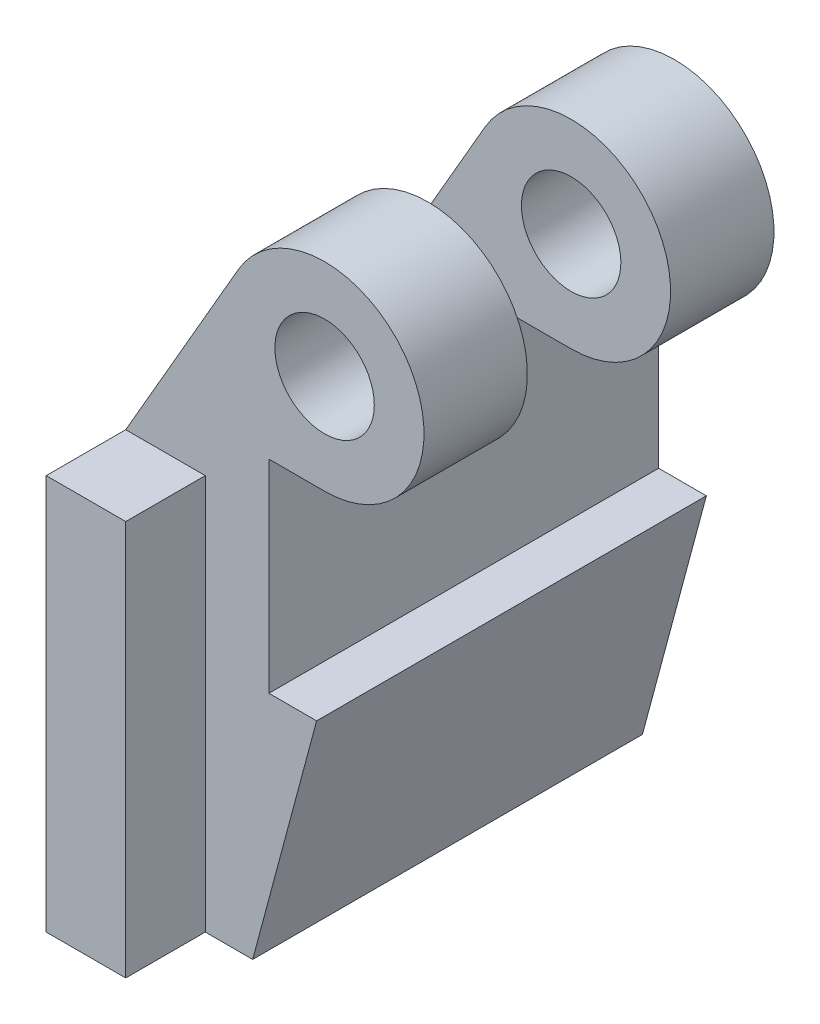
ISO-10303-21;
HEADER;
FILE_DESCRIPTION(('STEP AP214'),'2;1');
FILE_NAME('part.step','',(''),(''),'','','');
FILE_SCHEMA(('AUTOMOTIVE_DESIGN { 1 0 10303 214 1 1 1 1 }'));
ENDSEC;
DATA;
#1=APPLICATION_CONTEXT('core data for automotive mechanical design processes');
#2=APPLICATION_PROTOCOL_DEFINITION('international standard','automotive_design',2000,#1);
#3=PRODUCT_CONTEXT('',#1,'mechanical');
#4=PRODUCT('Part','Part','',(#3));
#5=PRODUCT_RELATED_PRODUCT_CATEGORY('part','',(#4));
#6=PRODUCT_DEFINITION_FORMATION('','',#4);
#7=PRODUCT_DEFINITION_CONTEXT('part definition',#1,'design');
#8=PRODUCT_DEFINITION('design','',#6,#7);
#9=PRODUCT_DEFINITION_SHAPE('','',#8);
#10=(LENGTH_UNIT() NAMED_UNIT(*) SI_UNIT(.MILLI.,.METRE.));
#11=(NAMED_UNIT(*) PLANE_ANGLE_UNIT() SI_UNIT($,.RADIAN.));
#12=(NAMED_UNIT(*) SI_UNIT($,.STERADIAN.) SOLID_ANGLE_UNIT());
#13=UNCERTAINTY_MEASURE_WITH_UNIT(LENGTH_MEASURE(1.E-05),#10,'distance_accuracy_value','');
#14=(GEOMETRIC_REPRESENTATION_CONTEXT(3) GLOBAL_UNCERTAINTY_ASSIGNED_CONTEXT((#13)) GLOBAL_UNIT_ASSIGNED_CONTEXT((#10,
#11,#12)) REPRESENTATION_CONTEXT('',''));
#15=CARTESIAN_POINT('',(0.,0.,0.));
#16=DIRECTION('',(0.,0.,1.));
#17=DIRECTION('',(1.,0.,0.));
#18=AXIS2_PLACEMENT_3D('',#15,#16,#17);
#19=CARTESIAN_POINT('',(-4.699,-4.318,5.08));
#20=DIRECTION('',(-1.,0.,0.));
#21=DIRECTION('',(0.,0.,1.));
#22=AXIS2_PLACEMENT_3D('',#19,#20,#21);
#23=PLANE('',#22);
#24=DIRECTION('',(0.,0.,1.));
#25=VECTOR('',#24,1.);
#26=CARTESIAN_POINT('',(-4.699,-2.667,5.08));
#27=LINE('',#26,#25);
#28=CARTESIAN_POINT('',(-4.699,-2.667,-1.143));
#29=VERTEX_POINT('',#28);
#30=CARTESIAN_POINT('',(-4.69900000000001,-2.667,-0.508));
#31=VERTEX_POINT('',#30);
#32=EDGE_CURVE('E543',#29,#31,#27,.T.);
#33=ORIENTED_EDGE('',*,*,#32,.T.);
#34=DIRECTION('',(0.,1.,0.));
#35=VECTOR('',#34,1.);
#36=CARTESIAN_POINT('',(-4.699,-4.318,-0.508));
#37=LINE('',#36,#35);
#38=CARTESIAN_POINT('',(-4.699,-2.6035,-0.508));
#39=VERTEX_POINT('',#38);
#40=EDGE_CURVE('E552',#31,#39,#37,.T.);
#41=ORIENTED_EDGE('',*,*,#40,.T.);
#42=DIRECTION('',(0.,0.,-1.));
#43=VECTOR('',#42,1.);
#44=CARTESIAN_POINT('',(-4.699,-2.6035,5.08));
#45=LINE('',#44,#43);
#46=CARTESIAN_POINT('',(-4.699,-2.6035,1.143));
#47=VERTEX_POINT('',#46);
#48=EDGE_CURVE('E659',#47,#39,#45,.T.);
#49=ORIENTED_EDGE('',*,*,#48,.F.);
#50=DIRECTION('',(0.,1.,0.));
#51=VECTOR('',#50,1.);
#52=CARTESIAN_POINT('',(-4.699,-4.318,1.143));
#53=LINE('',#52,#51);
#54=CARTESIAN_POINT('',(-4.699,-2.667,1.143));
#55=VERTEX_POINT('',#54);
#56=EDGE_CURVE('E577',#55,#47,#53,.T.);
#57=ORIENTED_EDGE('',*,*,#56,.F.);
#58=DIRECTION('',(0.,0.,1.));
#59=VECTOR('',#58,1.);
#60=CARTESIAN_POINT('',(-4.699,-2.667,5.08));
#61=LINE('',#60,#59);
#62=CARTESIAN_POINT('',(-4.699,-2.667,3.429));
#63=VERTEX_POINT('',#62);
#64=EDGE_CURVE('E580',#55,#63,#61,.T.);
#65=ORIENTED_EDGE('',*,*,#64,.T.);
#66=DIRECTION('',(0.,1.,0.));
#67=VECTOR('',#66,1.);
#68=CARTESIAN_POINT('',(-4.699,-4.318,3.429));
#69=LINE('',#68,#67);
#70=CARTESIAN_POINT('',(-4.699,-2.6035,3.429));
#71=VERTEX_POINT('',#70);
#72=EDGE_CURVE('E567',#63,#71,#69,.T.);
#73=ORIENTED_EDGE('',*,*,#72,.T.);
#74=CARTESIAN_POINT('',(-4.699,-2.6035,5.08));
#75=VERTEX_POINT('',#74);
#76=EDGE_CURVE('E502',#75,#71,#45,.T.);
#77=ORIENTED_EDGE('',*,*,#76,.F.);
#78=DIRECTION('',(0.,-1.,0.));
#79=VECTOR('',#78,1.);
#80=CARTESIAN_POINT('',(-4.699,-4.318,5.08));
#81=LINE('',#80,#79);
#82=CARTESIAN_POINT('',(-4.699,-5.842,5.08));
#83=VERTEX_POINT('',#82);
#84=EDGE_CURVE('E494',#75,#83,#81,.T.);
#85=ORIENTED_EDGE('',*,*,#84,.T.);
#86=DIRECTION('',(0.,0.,1.));
#87=VECTOR('',#86,1.);
#88=CARTESIAN_POINT('',(-4.699,-5.842,-1.143));
#89=LINE('',#88,#87);
#90=CARTESIAN_POINT('',(-4.699,-5.842,-1.143));
#91=VERTEX_POINT('',#90);
#92=EDGE_CURVE('E498',#91,#83,#89,.T.);
#93=ORIENTED_EDGE('',*,*,#92,.F.);
#94=DIRECTION('',(0.,-1.,0.));
#95=VECTOR('',#94,1.);
#96=CARTESIAN_POINT('',(-4.699,-4.318,-1.143));
#97=LINE('',#96,#95);
#98=EDGE_CURVE('E606',#29,#91,#97,.T.);
#99=ORIENTED_EDGE('',*,*,#98,.F.);
#100=EDGE_LOOP('',(#33,#41,#49,#57,#65,#73,#77,#85,#93,#99));
#101=FACE_BOUND('',#100,.T.);
#102=ADVANCED_FACE('F372',(#101),#23,.F.);
#103=CARTESIAN_POINT('',(-5.1848153285078,-0.222250000000008,5.08));
#104=DIRECTION('',(0.866025403784442,-0.499999999999995,0.));
#105=DIRECTION('',(-0.499999999999995,-0.866025403784442,0.));
#106=AXIS2_PLACEMENT_3D('',#103,#104,#105);
#107=PLANE('',#106);
#108=DIRECTION('',(0.499999999999995,0.866025403784442,0.));
#109=VECTOR('',#108,1.);
#110=CARTESIAN_POINT('',(-5.1848153285078,-0.222250000000008,5.08));
#111=LINE('',#110,#109);
#112=CARTESIAN_POINT('',(-6.985,-3.3402613140312,5.08));
#113=VERTEX_POINT('',#112);
#114=CARTESIAN_POINT('',(-5.1848153285078,-0.222250000000008,5.08));
#115=VERTEX_POINT('',#114);
#116=EDGE_CURVE('E627',#113,#115,#111,.T.);
#117=ORIENTED_EDGE('',*,*,#116,.T.);
#118=DIRECTION('',(0.,0.,-1.));
#119=VECTOR('',#118,1.);
#120=CARTESIAN_POINT('',(-5.1848153285078,-0.222250000000008,5.08));
#121=LINE('',#120,#119);
#122=CARTESIAN_POINT('',(-5.1848153285078,-0.222250000000008,3.429));
#123=VERTEX_POINT('',#122);
#124=EDGE_CURVE('E647',#115,#123,#121,.T.);
#125=ORIENTED_EDGE('',*,*,#124,.T.);
#126=DIRECTION('',(-0.499999999999995,-0.866025403784442,0.));
#127=VECTOR('',#126,1.);
#128=CARTESIAN_POINT('',(-5.1848153285078,-0.222250000000008,3.429));
#129=LINE('',#128,#127);
#130=CARTESIAN_POINT('',(-6.59629239910912,-2.667,3.429));
#131=VERTEX_POINT('',#130);
#132=EDGE_CURVE('E564',#123,#131,#129,.T.);
#133=ORIENTED_EDGE('',*,*,#132,.T.);
#134=DIRECTION('',(0.,0.,-1.));
#135=VECTOR('',#134,1.);
#136=CARTESIAN_POINT('',(-6.59629239910912,-2.667,5.08));
#137=LINE('',#136,#135);
#138=CARTESIAN_POINT('',(-6.59629239910912,-2.667,1.143));
#139=VERTEX_POINT('',#138);
#140=EDGE_CURVE('E380',#131,#139,#137,.T.);
#141=ORIENTED_EDGE('',*,*,#140,.T.);
#142=DIRECTION('',(-0.499999999999995,-0.866025403784442,0.));
#143=VECTOR('',#142,1.);
#144=CARTESIAN_POINT('',(-5.1848153285078,-0.222250000000008,1.143));
#145=LINE('',#144,#143);
#146=CARTESIAN_POINT('',(-5.1848153285078,-0.222250000000008,1.143));
#147=VERTEX_POINT('',#146);
#148=EDGE_CURVE('E574',#147,#139,#145,.T.);
#149=ORIENTED_EDGE('',*,*,#148,.F.);
#150=CARTESIAN_POINT('',(-5.1848153285078,-0.222250000000008,-0.508));
#151=VERTEX_POINT('',#150);
#152=EDGE_CURVE('E652',#147,#151,#121,.T.);
#153=ORIENTED_EDGE('',*,*,#152,.T.);
#154=DIRECTION('',(-0.499999999999995,-0.866025403784442,0.));
#155=VECTOR('',#154,1.);
#156=CARTESIAN_POINT('',(-5.1848153285078,-0.222250000000008,-0.508));
#157=LINE('',#156,#155);
#158=CARTESIAN_POINT('',(-6.59629239910912,-2.667,-0.508));
#159=VERTEX_POINT('',#158);
#160=EDGE_CURVE('E549',#151,#159,#157,.T.);
#161=ORIENTED_EDGE('',*,*,#160,.T.);
#162=DIRECTION('',(0.,0.,-1.));
#163=VECTOR('',#162,1.);
#164=CARTESIAN_POINT('',(-6.59629239910912,-2.667,5.08));
#165=LINE('',#164,#163);
#166=CARTESIAN_POINT('',(-6.59629239910912,-2.667,-1.143));
#167=VERTEX_POINT('',#166);
#168=EDGE_CURVE('E540',#159,#167,#165,.T.);
#169=ORIENTED_EDGE('',*,*,#168,.T.);
#170=DIRECTION('',(0.499999999999995,0.866025403784442,0.));
#171=VECTOR('',#170,1.);
#172=CARTESIAN_POINT('',(-5.1848153285078,-0.222250000000008,-1.143));
#173=LINE('',#172,#171);
#174=CARTESIAN_POINT('',(-6.985,-3.3402613140312,-1.143));
#175=VERTEX_POINT('',#174);
#176=EDGE_CURVE('E595',#175,#167,#173,.T.);
#177=ORIENTED_EDGE('',*,*,#176,.F.);
#178=DIRECTION('',(0.,0.,1.));
#179=VECTOR('',#178,1.);
#180=CARTESIAN_POINT('',(-6.985,-3.3402613140312,-9.74867054586526));
#181=LINE('',#180,#179);
#182=EDGE_CURVE('E591',#175,#113,#181,.T.);
#183=ORIENTED_EDGE('',*,*,#182,.T.);
#184=EDGE_LOOP('',(#117,#125,#133,#141,#149,#153,#161,#169,#177,#183));
#185=FACE_BOUND('',#184,.T.);
#186=ADVANCED_FACE('F676',(#185),#107,.F.);
#187=CARTESIAN_POINT('',(-3.81,-1.016,5.08));
#188=DIRECTION('',(0.,0.,-1.));
#189=DIRECTION('',(-1.,0.,0.));
#190=AXIS2_PLACEMENT_3D('',#187,#188,#189);
#191=CYLINDRICAL_SURFACE('',#190,1.5875);
#192=CARTESIAN_POINT('',(-3.81,-1.016,-0.508));
#193=DIRECTION('',(0.,0.,1.));
#194=DIRECTION('',(-1.,0.,0.));
#195=AXIS2_PLACEMENT_3D('',#192,#193,#194);
#196=CIRCLE('',#195,1.5875);
#197=CARTESIAN_POINT('',(-3.81,-2.6035,-0.508));
#198=VERTEX_POINT('',#197);
#199=EDGE_CURVE('E547',#198,#151,#196,.T.);
#200=ORIENTED_EDGE('',*,*,#199,.T.);
#201=ORIENTED_EDGE('',*,*,#152,.F.);
#202=CARTESIAN_POINT('',(-3.81,-1.016,1.143));
#203=DIRECTION('',(0.,0.,1.));
#204=DIRECTION('',(0.,-1.,0.));
#205=AXIS2_PLACEMENT_3D('',#202,#203,#204);
#206=CIRCLE('',#205,1.5875);
#207=CARTESIAN_POINT('',(-3.81,-2.6035,1.143));
#208=VERTEX_POINT('',#207);
#209=EDGE_CURVE('E572',#208,#147,#206,.T.);
#210=ORIENTED_EDGE('',*,*,#209,.F.);
#211=DIRECTION('',(0.,0.,-1.));
#212=VECTOR('',#211,1.);
#213=CARTESIAN_POINT('',(-3.81,-2.6035,5.08));
#214=LINE('',#213,#212);
#215=EDGE_CURVE('E658',#208,#198,#214,.T.);
#216=ORIENTED_EDGE('',*,*,#215,.T.);
#217=EDGE_LOOP('',(#200,#201,#210,#216));
#218=FACE_BOUND('',#217,.T.);
#219=ADVANCED_FACE('F728',(#218),#191,.T.);
#220=CARTESIAN_POINT('',(-4.699,-2.6035,5.08));
#221=DIRECTION('',(0.,1.,0.));
#222=DIRECTION('',(0.,0.,-1.));
#223=AXIS2_PLACEMENT_3D('',#220,#221,#222);
#224=PLANE('',#223);
#225=DIRECTION('',(1.,0.,0.));
#226=VECTOR('',#225,1.);
#227=CARTESIAN_POINT('',(-4.699,-2.6035,-0.508));
#228=LINE('',#227,#226);
#229=EDGE_CURVE('E545',#39,#198,#228,.T.);
#230=ORIENTED_EDGE('',*,*,#229,.T.);
#231=ORIENTED_EDGE('',*,*,#215,.F.);
#232=DIRECTION('',(1.,0.,0.));
#233=VECTOR('',#232,1.);
#234=CARTESIAN_POINT('',(-4.699,-2.6035,1.143));
#235=LINE('',#234,#233);
#236=EDGE_CURVE('E570',#47,#208,#235,.T.);
#237=ORIENTED_EDGE('',*,*,#236,.F.);
#238=ORIENTED_EDGE('',*,*,#48,.T.);
#239=EDGE_LOOP('',(#230,#231,#237,#238));
#240=FACE_BOUND('',#239,.T.);
#241=ADVANCED_FACE('F701',(#240),#224,.F.);
#242=CARTESIAN_POINT('',(-3.81,-1.016,5.08));
#243=DIRECTION('',(0.,0.,-1.));
#244=DIRECTION('',(-1.,0.,0.));
#245=AXIS2_PLACEMENT_3D('',#242,#243,#244);
#246=CYLINDRICAL_SURFACE('',#245,0.793750000000003);
#247=CARTESIAN_POINT('',(-3.81,-1.016,1.143));
#248=DIRECTION('',(0.,0.,1.));
#249=DIRECTION('',(0.,-1.,0.));
#250=AXIS2_PLACEMENT_3D('',#247,#248,#249);
#251=CIRCLE('',#250,0.793750000000003);
#252=CARTESIAN_POINT('',(-3.81,-1.80975,1.143));
#253=VERTEX_POINT('',#252);
#254=EDGE_CURVE('E569',#253,#253,#251,.T.);
#255=ORIENTED_EDGE('',*,*,#254,.T.);
#256=EDGE_LOOP('',(#255));
#257=FACE_BOUND('',#256,.T.);
#258=CARTESIAN_POINT('',(-3.81,-1.016,-0.508));
#259=DIRECTION('',(0.,0.,1.));
#260=DIRECTION('',(-1.,0.,0.));
#261=AXIS2_PLACEMENT_3D('',#258,#259,#260);
#262=CIRCLE('',#261,0.793750000000003);
#263=CARTESIAN_POINT('',(-4.60375,-1.016,-0.508));
#264=VERTEX_POINT('',#263);
#265=EDGE_CURVE('E375',#264,#264,#262,.T.);
#266=ORIENTED_EDGE('',*,*,#265,.F.);
#267=EDGE_LOOP('',(#266));
#268=FACE_BOUND('',#267,.T.);
#269=ADVANCED_FACE('F750',(#257,#268),#246,.F.);
#270=CARTESIAN_POINT('',(-5.715,-10.0622750118298,-1.143));
#271=DIRECTION('',(0.,0.,1.));
#272=DIRECTION('',(0.,1.,0.));
#273=AXIS2_PLACEMENT_3D('',#270,#271,#272);
#274=PLANE('',#273);
#275=ORIENTED_EDGE('',*,*,#98,.T.);
#276=DIRECTION('',(1.,0.,0.));
#277=VECTOR('',#276,1.);
#278=CARTESIAN_POINT('',(-4.699,-5.842,-1.143));
#279=LINE('',#278,#277);
#280=CARTESIAN_POINT('',(-3.937,-5.842,-1.143));
#281=VERTEX_POINT('',#280);
#282=EDGE_CURVE('E513',#91,#281,#279,.T.);
#283=ORIENTED_EDGE('',*,*,#282,.T.);
#284=DIRECTION('',(-0.258819045102518,-0.965925826289069,0.));
#285=VECTOR('',#284,1.);
#286=CARTESIAN_POINT('',(-3.937,-5.842,-1.143));
#287=LINE('',#286,#285);
#288=CARTESIAN_POINT('',(-4.95788642316257,-9.652,-1.143));
#289=VERTEX_POINT('',#288);
#290=EDGE_CURVE('E608',#281,#289,#287,.T.);
#291=ORIENTED_EDGE('',*,*,#290,.T.);
#292=DIRECTION('',(-1.,0.,0.));
#293=VECTOR('',#292,1.);
#294=CARTESIAN_POINT('',(-4.95788642316257,-9.652,-1.143));
#295=LINE('',#294,#293);
#296=CARTESIAN_POINT('',(-6.985,-9.652,-1.143));
#297=VERTEX_POINT('',#296);
#298=EDGE_CURVE('E611',#289,#297,#295,.T.);
#299=ORIENTED_EDGE('',*,*,#298,.T.);
#300=DIRECTION('',(0.,-1.,0.));
#301=VECTOR('',#300,1.);
#302=CARTESIAN_POINT('',(-6.985,-9.652,-1.143));
#303=LINE('',#302,#301);
#304=EDGE_CURVE('E592',#175,#297,#303,.T.);
#305=ORIENTED_EDGE('',*,*,#304,.F.);
#306=ORIENTED_EDGE('',*,*,#176,.T.);
#307=DIRECTION('',(1.,0.,0.));
#308=VECTOR('',#307,1.);
#309=CARTESIAN_POINT('',(-5.715,-2.667,-1.143));
#310=LINE('',#309,#308);
#311=EDGE_CURVE('E11',#167,#29,#310,.T.);
#312=ORIENTED_EDGE('',*,*,#311,.T.);
#313=EDGE_LOOP('',(#275,#283,#291,#299,#305,#306,#312));
#314=FACE_BOUND('',#313,.T.);
#315=ADVANCED_FACE('F691',(#314),#274,.F.);
#316=CARTESIAN_POINT('',(-3.81,-1.016,3.429));
#317=DIRECTION('',(0.,0.,1.));
#318=DIRECTION('',(0.,-1.,0.));
#319=AXIS2_PLACEMENT_3D('',#316,#317,#318);
#320=CIRCLE('',#319,1.5875);
#321=CARTESIAN_POINT('',(-3.81,-2.6035,3.429));
#322=VERTEX_POINT('',#321);
#323=EDGE_CURVE('E562',#322,#123,#320,.T.);
#324=ORIENTED_EDGE('',*,*,#323,.T.);
#325=ORIENTED_EDGE('',*,*,#124,.F.);
#326=CARTESIAN_POINT('',(-3.81,-1.016,5.08));
#327=DIRECTION('',(0.,0.,-1.));
#328=DIRECTION('',(-1.,0.,0.));
#329=AXIS2_PLACEMENT_3D('',#326,#327,#328);
#330=CIRCLE('',#329,1.5875);
#331=CARTESIAN_POINT('',(-3.81,-2.6035,5.08));
#332=VERTEX_POINT('',#331);
#333=EDGE_CURVE('E620',#115,#332,#330,.T.);
#334=ORIENTED_EDGE('',*,*,#333,.T.);
#335=EDGE_CURVE('E655',#332,#322,#214,.T.);
#336=ORIENTED_EDGE('',*,*,#335,.T.);
#337=EDGE_LOOP('',(#324,#325,#334,#336));
#338=FACE_BOUND('',#337,.T.);
#339=ADVANCED_FACE('F667',(#338),#191,.T.);
#340=DIRECTION('',(1.,0.,0.));
#341=VECTOR('',#340,1.);
#342=CARTESIAN_POINT('',(-4.699,-2.6035,3.429));
#343=LINE('',#342,#341);
#344=EDGE_CURVE('E560',#71,#322,#343,.T.);
#345=ORIENTED_EDGE('',*,*,#344,.T.);
#346=ORIENTED_EDGE('',*,*,#335,.F.);
#347=DIRECTION('',(-1.,0.,0.));
#348=VECTOR('',#347,1.);
#349=CARTESIAN_POINT('',(-4.699,-2.6035,5.08));
#350=LINE('',#349,#348);
#351=EDGE_CURVE('E660',#332,#75,#350,.T.);
#352=ORIENTED_EDGE('',*,*,#351,.T.);
#353=ORIENTED_EDGE('',*,*,#76,.T.);
#354=EDGE_LOOP('',(#345,#346,#352,#353));
#355=FACE_BOUND('',#354,.T.);
#356=ADVANCED_FACE('F671',(#355),#224,.F.);
#357=CARTESIAN_POINT('',(-3.81,-1.016,5.08));
#358=DIRECTION('',(0.,0.,-1.));
#359=DIRECTION('',(1.,0.,0.));
#360=AXIS2_PLACEMENT_3D('',#357,#358,#359);
#361=CIRCLE('',#360,0.793750000000003);
#362=CARTESIAN_POINT('',(-3.01625,-1.016,5.08));
#363=VERTEX_POINT('',#362);
#364=EDGE_CURVE('E506',#363,#363,#361,.T.);
#365=ORIENTED_EDGE('',*,*,#364,.F.);
#366=EDGE_LOOP('',(#365));
#367=FACE_BOUND('',#366,.T.);
#368=CARTESIAN_POINT('',(-3.81,-1.016,3.429));
#369=DIRECTION('',(0.,0.,1.));
#370=DIRECTION('',(0.,-1.,0.));
#371=AXIS2_PLACEMENT_3D('',#368,#369,#370);
#372=CIRCLE('',#371,0.793750000000003);
#373=CARTESIAN_POINT('',(-3.81,-1.80975,3.429));
#374=VERTEX_POINT('',#373);
#375=EDGE_CURVE('E559',#374,#374,#372,.T.);
#376=ORIENTED_EDGE('',*,*,#375,.F.);
#377=EDGE_LOOP('',(#376));
#378=FACE_BOUND('',#377,.T.);
#379=ADVANCED_FACE('F743',(#367,#378),#246,.F.);
#380=CARTESIAN_POINT('',(-3.81,-1.016,5.08));
#381=DIRECTION('',(0.,0.,-1.));
#382=DIRECTION('',(-1.,0.,0.));
#383=AXIS2_PLACEMENT_3D('',#380,#381,#382);
#384=PLANE('',#383);
#385=DIRECTION('',(1.,0.,0.));
#386=VECTOR('',#385,1.);
#387=CARTESIAN_POINT('',(-4.699,-5.842,5.08));
#388=LINE('',#387,#386);
#389=CARTESIAN_POINT('',(-3.937,-5.842,5.08));
#390=VERTEX_POINT('',#389);
#391=EDGE_CURVE('E510',#83,#390,#388,.T.);
#392=ORIENTED_EDGE('',*,*,#391,.F.);
#393=ORIENTED_EDGE('',*,*,#84,.F.);
#394=ORIENTED_EDGE('',*,*,#351,.F.);
#395=ORIENTED_EDGE('',*,*,#333,.F.);
#396=ORIENTED_EDGE('',*,*,#116,.F.);
#397=DIRECTION('',(-1.,0.,0.));
#398=VECTOR('',#397,1.);
#399=CARTESIAN_POINT('',(-6.985,-3.3402613140312,5.08));
#400=LINE('',#399,#398);
#401=CARTESIAN_POINT('',(-5.71500000000001,-3.34026131403121,5.08));
#402=VERTEX_POINT('',#401);
#403=EDGE_CURVE('E525',#402,#113,#400,.T.);
#404=ORIENTED_EDGE('',*,*,#403,.F.);
#405=DIRECTION('',(0.,1.,0.));
#406=VECTOR('',#405,1.);
#407=CARTESIAN_POINT('',(-5.715,-9.652,5.08));
#408=LINE('',#407,#406);
#409=CARTESIAN_POINT('',(-5.715,-9.652,5.08));
#410=VERTEX_POINT('',#409);
#411=EDGE_CURVE('E623',#410,#402,#408,.T.);
#412=ORIENTED_EDGE('',*,*,#411,.F.);
#413=DIRECTION('',(-1.,0.,0.));
#414=VECTOR('',#413,1.);
#415=CARTESIAN_POINT('',(-4.95788642316257,-9.652,5.08));
#416=LINE('',#415,#414);
#417=CARTESIAN_POINT('',(-4.95788642316257,-9.652,5.08));
#418=VERTEX_POINT('',#417);
#419=EDGE_CURVE('E617',#418,#410,#416,.T.);
#420=ORIENTED_EDGE('',*,*,#419,.F.);
#421=DIRECTION('',(-0.258819045102518,-0.965925826289069,0.));
#422=VECTOR('',#421,1.);
#423=CARTESIAN_POINT('',(-3.937,-5.842,5.08));
#424=LINE('',#423,#422);
#425=EDGE_CURVE('E505',#390,#418,#424,.T.);
#426=ORIENTED_EDGE('',*,*,#425,.F.);
#427=EDGE_LOOP('',(#392,#393,#394,#395,#396,#404,#412,#420,#426));
#428=FACE_BOUND('',#427,.T.);
#429=ORIENTED_EDGE('',*,*,#364,.T.);
#430=EDGE_LOOP('',(#429));
#431=FACE_BOUND('',#430,.T.);
#432=ADVANCED_FACE('F516',(#428,#431),#384,.F.);
#433=CARTESIAN_POINT('',(-3.937,-5.842,5.08));
#434=DIRECTION('',(-0.965925826289069,0.258819045102518,0.));
#435=DIRECTION('',(0.258819045102518,0.965925826289069,0.));
#436=AXIS2_PLACEMENT_3D('',#433,#434,#435);
#437=PLANE('',#436);
#438=DIRECTION('',(0.,0.,-1.));
#439=VECTOR('',#438,1.);
#440=CARTESIAN_POINT('',(-3.937,-5.842,5.08));
#441=LINE('',#440,#439);
#442=EDGE_CURVE('E628',#390,#281,#441,.T.);
#443=ORIENTED_EDGE('',*,*,#442,.F.);
#444=ORIENTED_EDGE('',*,*,#425,.T.);
#445=DIRECTION('',(0.,0.,-1.));
#446=VECTOR('',#445,1.);
#447=CARTESIAN_POINT('',(-4.95788642316257,-9.652,5.08));
#448=LINE('',#447,#446);
#449=EDGE_CURVE('E646',#418,#289,#448,.T.);
#450=ORIENTED_EDGE('',*,*,#449,.T.);
#451=ORIENTED_EDGE('',*,*,#290,.F.);
#452=EDGE_LOOP('',(#443,#444,#450,#451));
#453=FACE_BOUND('',#452,.T.);
#454=ADVANCED_FACE('F689',(#453),#437,.F.);
#455=CARTESIAN_POINT('',(-4.95788642316257,-9.652,5.08));
#456=DIRECTION('',(0.,1.,0.));
#457=DIRECTION('',(1.,0.,0.));
#458=AXIS2_PLACEMENT_3D('',#455,#456,#457);
#459=PLANE('',#458);
#460=ORIENTED_EDGE('',*,*,#449,.F.);
#461=ORIENTED_EDGE('',*,*,#419,.T.);
#462=DIRECTION('',(0.,0.,1.));
#463=VECTOR('',#462,1.);
#464=CARTESIAN_POINT('',(-5.715,-9.652,-9.74867054586526));
#465=LINE('',#464,#463);
#466=CARTESIAN_POINT('',(-5.715,-9.652,6.35));
#467=VERTEX_POINT('',#466);
#468=EDGE_CURVE('E599',#410,#467,#465,.T.);
#469=ORIENTED_EDGE('',*,*,#468,.T.);
#470=DIRECTION('',(-1.,0.,0.));
#471=VECTOR('',#470,1.);
#472=CARTESIAN_POINT('',(-6.985,-9.652,6.35));
#473=LINE('',#472,#471);
#474=CARTESIAN_POINT('',(-6.985,-9.652,6.35));
#475=VERTEX_POINT('',#474);
#476=EDGE_CURVE('E588',#467,#475,#473,.T.);
#477=ORIENTED_EDGE('',*,*,#476,.T.);
#478=DIRECTION('',(0.,0.,1.));
#479=VECTOR('',#478,1.);
#480=CARTESIAN_POINT('',(-6.985,-9.652,-9.74867054586526));
#481=LINE('',#480,#479);
#482=EDGE_CURVE('E596',#297,#475,#481,.T.);
#483=ORIENTED_EDGE('',*,*,#482,.F.);
#484=ORIENTED_EDGE('',*,*,#298,.F.);
#485=EDGE_LOOP('',(#460,#461,#469,#477,#483,#484));
#486=FACE_BOUND('',#485,.T.);
#487=ADVANCED_FACE('F688',(#486),#459,.F.);
#488=CARTESIAN_POINT('',(-5.715,-9.652,-9.74867054586526));
#489=DIRECTION('',(1.,0.,0.));
#490=DIRECTION('',(0.,-1.,0.));
#491=AXIS2_PLACEMENT_3D('',#488,#489,#490);
#492=PLANE('',#491);
#493=DIRECTION('',(0.,0.,1.));
#494=VECTOR('',#493,1.);
#495=CARTESIAN_POINT('',(-5.71500000000001,-3.34026131403121,2.53999999999999));
#496=LINE('',#495,#494);
#497=CARTESIAN_POINT('',(-5.715,-3.3402613140312,6.35));
#498=VERTEX_POINT('',#497);
#499=EDGE_CURVE('E524',#402,#498,#496,.T.);
#500=ORIENTED_EDGE('',*,*,#499,.T.);
#501=DIRECTION('',(0.,-1.,0.));
#502=VECTOR('',#501,1.);
#503=CARTESIAN_POINT('',(-5.715,-9.652,6.35));
#504=LINE('',#503,#502);
#505=EDGE_CURVE('E586',#498,#467,#504,.T.);
#506=ORIENTED_EDGE('',*,*,#505,.T.);
#507=ORIENTED_EDGE('',*,*,#468,.F.);
#508=ORIENTED_EDGE('',*,*,#411,.T.);
#509=EDGE_LOOP('',(#500,#506,#507,#508));
#510=FACE_BOUND('',#509,.T.);
#511=ADVANCED_FACE('F685',(#510),#492,.T.);
#512=CARTESIAN_POINT('',(-6.985,-9.652,-9.74867054586526));
#513=DIRECTION('',(-1.,0.,0.));
#514=DIRECTION('',(0.,1.,0.));
#515=AXIS2_PLACEMENT_3D('',#512,#513,#514);
#516=PLANE('',#515);
#517=ORIENTED_EDGE('',*,*,#304,.T.);
#518=ORIENTED_EDGE('',*,*,#482,.T.);
#519=DIRECTION('',(0.,1.,0.));
#520=VECTOR('',#519,1.);
#521=CARTESIAN_POINT('',(-6.985,-9.652,6.35));
#522=LINE('',#521,#520);
#523=CARTESIAN_POINT('',(-6.985,-3.3402613140312,6.35));
#524=VERTEX_POINT('',#523);
#525=EDGE_CURVE('E583',#475,#524,#522,.T.);
#526=ORIENTED_EDGE('',*,*,#525,.T.);
#527=DIRECTION('',(0.,0.,1.));
#528=VECTOR('',#527,1.);
#529=CARTESIAN_POINT('',(-6.985,-3.3402613140312,2.53999999999999));
#530=LINE('',#529,#528);
#531=EDGE_CURVE('E528',#113,#524,#530,.T.);
#532=ORIENTED_EDGE('',*,*,#531,.F.);
#533=ORIENTED_EDGE('',*,*,#182,.F.);
#534=EDGE_LOOP('',(#517,#518,#526,#532,#533));
#535=FACE_BOUND('',#534,.T.);
#536=ADVANCED_FACE('F681',(#535),#516,.T.);
#537=CARTESIAN_POINT('',(-6.985,-9.652,6.35));
#538=DIRECTION('',(0.,0.,1.));
#539=DIRECTION('',(1.,0.,0.));
#540=AXIS2_PLACEMENT_3D('',#537,#538,#539);
#541=PLANE('',#540);
#542=DIRECTION('',(-1.,0.,0.));
#543=VECTOR('',#542,1.);
#544=CARTESIAN_POINT('',(-6.985,-3.3402613140312,6.35));
#545=LINE('',#544,#543);
#546=EDGE_CURVE('E387',#498,#524,#545,.T.);
#547=ORIENTED_EDGE('',*,*,#546,.T.);
#548=ORIENTED_EDGE('',*,*,#525,.F.);
#549=ORIENTED_EDGE('',*,*,#476,.F.);
#550=ORIENTED_EDGE('',*,*,#505,.F.);
#551=EDGE_LOOP('',(#547,#548,#549,#550));
#552=FACE_BOUND('',#551,.T.);
#553=ADVANCED_FACE('F711',(#552),#541,.T.);
#554=CARTESIAN_POINT('',(-9.74051606002074,-2.667,1.143));
#555=DIRECTION('',(0.,1.,0.));
#556=DIRECTION('',(0.,0.,-1.));
#557=AXIS2_PLACEMENT_3D('',#554,#555,#556);
#558=PLANE('',#557);
#559=CARTESIAN_POINT('',(-5.715,-2.667,1.778));
#560=DIRECTION('',(0.,-1.,0.));
#561=DIRECTION('',(0.,0.,-1.));
#562=AXIS2_PLACEMENT_3D('',#559,#560,#561);
#563=CIRCLE('',#562,0.508);
#564=CARTESIAN_POINT('',(-5.715,-2.667,1.27));
#565=VERTEX_POINT('',#564);
#566=EDGE_CURVE('E530',#565,#565,#563,.T.);
#567=ORIENTED_EDGE('',*,*,#566,.T.);
#568=EDGE_LOOP('',(#567));
#569=FACE_BOUND('',#568,.T.);
#570=ORIENTED_EDGE('',*,*,#64,.F.);
#571=DIRECTION('',(1.,0.,0.));
#572=VECTOR('',#571,1.);
#573=CARTESIAN_POINT('',(-9.74051606002074,-2.667,1.143));
#574=LINE('',#573,#572);
#575=EDGE_CURVE('E557',#139,#55,#574,.T.);
#576=ORIENTED_EDGE('',*,*,#575,.F.);
#577=ORIENTED_EDGE('',*,*,#140,.F.);
#578=DIRECTION('',(1.,0.,0.));
#579=VECTOR('',#578,1.);
#580=CARTESIAN_POINT('',(-9.74051606002074,-2.667,3.429));
#581=LINE('',#580,#579);
#582=EDGE_CURVE('E555',#131,#63,#581,.T.);
#583=ORIENTED_EDGE('',*,*,#582,.T.);
#584=EDGE_LOOP('',(#570,#576,#577,#583));
#585=FACE_BOUND('',#584,.T.);
#586=ADVANCED_FACE('F709',(#569,#585),#558,.T.);
#587=CARTESIAN_POINT('',(-9.74051606002074,-2.667,1.143));
#588=DIRECTION('',(0.,0.,-1.));
#589=DIRECTION('',(0.,-1.,0.));
#590=AXIS2_PLACEMENT_3D('',#587,#588,#589);
#591=PLANE('',#590);
#592=ORIENTED_EDGE('',*,*,#254,.F.);
#593=EDGE_LOOP('',(#592));
#594=FACE_BOUND('',#593,.T.);
#595=ORIENTED_EDGE('',*,*,#575,.T.);
#596=ORIENTED_EDGE('',*,*,#56,.T.);
#597=ORIENTED_EDGE('',*,*,#236,.T.);
#598=ORIENTED_EDGE('',*,*,#209,.T.);
#599=ORIENTED_EDGE('',*,*,#148,.T.);
#600=EDGE_LOOP('',(#595,#596,#597,#598,#599));
#601=FACE_BOUND('',#600,.T.);
#602=ADVANCED_FACE('F706',(#594,#601),#591,.F.);
#603=CARTESIAN_POINT('',(-9.74051606002074,-2.667,3.429));
#604=DIRECTION('',(0.,0.,-1.));
#605=DIRECTION('',(0.,-1.,0.));
#606=AXIS2_PLACEMENT_3D('',#603,#604,#605);
#607=PLANE('',#606);
#608=ORIENTED_EDGE('',*,*,#375,.T.);
#609=EDGE_LOOP('',(#608));
#610=FACE_BOUND('',#609,.T.);
#611=ORIENTED_EDGE('',*,*,#72,.F.);
#612=ORIENTED_EDGE('',*,*,#582,.F.);
#613=ORIENTED_EDGE('',*,*,#132,.F.);
#614=ORIENTED_EDGE('',*,*,#323,.F.);
#615=ORIENTED_EDGE('',*,*,#344,.F.);
#616=EDGE_LOOP('',(#611,#612,#613,#614,#615));
#617=FACE_BOUND('',#616,.T.);
#618=ADVANCED_FACE('F674',(#610,#617),#607,.T.);
#619=CARTESIAN_POINT('',(-12.5598636984989,-2.667,-0.508));
#620=DIRECTION('',(0.,0.,-1.));
#621=DIRECTION('',(-1.,0.,0.));
#622=AXIS2_PLACEMENT_3D('',#619,#620,#621);
#623=PLANE('',#622);
#624=ORIENTED_EDGE('',*,*,#265,.T.);
#625=EDGE_LOOP('',(#624));
#626=FACE_BOUND('',#625,.T.);
#627=ORIENTED_EDGE('',*,*,#40,.F.);
#628=DIRECTION('',(-1.,0.,0.));
#629=VECTOR('',#628,1.);
#630=CARTESIAN_POINT('',(-12.5598636984989,-2.667,-0.508));
#631=LINE('',#630,#629);
#632=EDGE_CURVE('E538',#31,#159,#631,.T.);
#633=ORIENTED_EDGE('',*,*,#632,.T.);
#634=ORIENTED_EDGE('',*,*,#160,.F.);
#635=ORIENTED_EDGE('',*,*,#199,.F.);
#636=ORIENTED_EDGE('',*,*,#229,.F.);
#637=EDGE_LOOP('',(#627,#633,#634,#635,#636));
#638=FACE_BOUND('',#637,.T.);
#639=ADVANCED_FACE('F696',(#626,#638),#623,.T.);
#640=CARTESIAN_POINT('',(-12.5598636984989,-2.667,-0.508));
#641=DIRECTION('',(0.,1.,0.));
#642=DIRECTION('',(0.,0.,-1.));
#643=AXIS2_PLACEMENT_3D('',#640,#641,#642);
#644=PLANE('',#643);
#645=ORIENTED_EDGE('',*,*,#32,.F.);
#646=ORIENTED_EDGE('',*,*,#311,.F.);
#647=ORIENTED_EDGE('',*,*,#168,.F.);
#648=ORIENTED_EDGE('',*,*,#632,.F.);
#649=EDGE_LOOP('',(#645,#646,#647,#648));
#650=FACE_BOUND('',#649,.T.);
#651=ADVANCED_FACE('F692',(#650),#644,.T.);
#652=CARTESIAN_POINT('',(-5.715,-5.207,1.778));
#653=DIRECTION('',(0.,1.,0.));
#654=DIRECTION('',(0.,0.,-1.));
#655=AXIS2_PLACEMENT_3D('',#652,#653,#654);
#656=CYLINDRICAL_SURFACE('',#655,0.508);
#657=CARTESIAN_POINT('',(-5.715,-5.207,1.778));
#658=DIRECTION('',(0.,-1.,0.));
#659=DIRECTION('',(0.,0.,-1.));
#660=AXIS2_PLACEMENT_3D('',#657,#658,#659);
#661=CIRCLE('',#660,0.508);
#662=CARTESIAN_POINT('',(-5.715,-5.207,1.27));
#663=VERTEX_POINT('',#662);
#664=EDGE_CURVE('E535',#663,#663,#661,.T.);
#665=ORIENTED_EDGE('',*,*,#664,.T.);
#666=EDGE_LOOP('',(#665));
#667=FACE_BOUND('',#666,.T.);
#668=ORIENTED_EDGE('',*,*,#566,.F.);
#669=EDGE_LOOP('',(#668));
#670=FACE_BOUND('',#669,.T.);
#671=ADVANCED_FACE('F808',(#667,#670),#656,.F.);
#672=CARTESIAN_POINT('',(-5.715,-5.207,1.778));
#673=DIRECTION('',(0.,1.,0.));
#674=DIRECTION('',(0.,0.,-1.));
#675=AXIS2_PLACEMENT_3D('',#672,#673,#674);
#676=PLANE('',#675);
#677=ORIENTED_EDGE('',*,*,#664,.F.);
#678=EDGE_LOOP('',(#677));
#679=FACE_BOUND('',#678,.T.);
#680=ADVANCED_FACE('F815',(#679),#676,.T.);
#681=CARTESIAN_POINT('',(-6.985,-3.3402613140312,2.53999999999999));
#682=DIRECTION('',(0.,-1.,0.));
#683=DIRECTION('',(-1.,0.,0.));
#684=AXIS2_PLACEMENT_3D('',#681,#682,#683);
#685=PLANE('',#684);
#686=ORIENTED_EDGE('',*,*,#499,.F.);
#687=ORIENTED_EDGE('',*,*,#403,.T.);
#688=ORIENTED_EDGE('',*,*,#531,.T.);
#689=ORIENTED_EDGE('',*,*,#546,.F.);
#690=EDGE_LOOP('',(#686,#687,#688,#689));
#691=FACE_BOUND('',#690,.T.);
#692=ADVANCED_FACE('F682',(#691),#685,.F.);
#693=CARTESIAN_POINT('',(-4.699,-5.842,-1.143));
#694=DIRECTION('',(0.,-1.,0.));
#695=DIRECTION('',(0.,0.,-1.));
#696=AXIS2_PLACEMENT_3D('',#693,#694,#695);
#697=PLANE('',#696);
#698=ORIENTED_EDGE('',*,*,#391,.T.);
#699=ORIENTED_EDGE('',*,*,#442,.T.);
#700=ORIENTED_EDGE('',*,*,#282,.F.);
#701=ORIENTED_EDGE('',*,*,#92,.T.);
#702=EDGE_LOOP('',(#698,#699,#700,#701));
#703=FACE_BOUND('',#702,.T.);
#704=ADVANCED_FACE('F509',(#703),#697,.F.);
#705=CLOSED_SHELL('',(#102,#186,#219,#241,#269,#315,#339,#356,#379,#432,#454,#487,#511,#536,
#553,#586,#602,#618,#639,#651,#671,#680,#692,#704));
#706=MANIFOLD_SOLID_BREP('B2',#705);
#707=ADVANCED_BREP_SHAPE_REPRESENTATION('',(#18,#706),#14);
#708=SHAPE_DEFINITION_REPRESENTATION(#9,#707);
ENDSEC;
END-ISO-10303-21;
